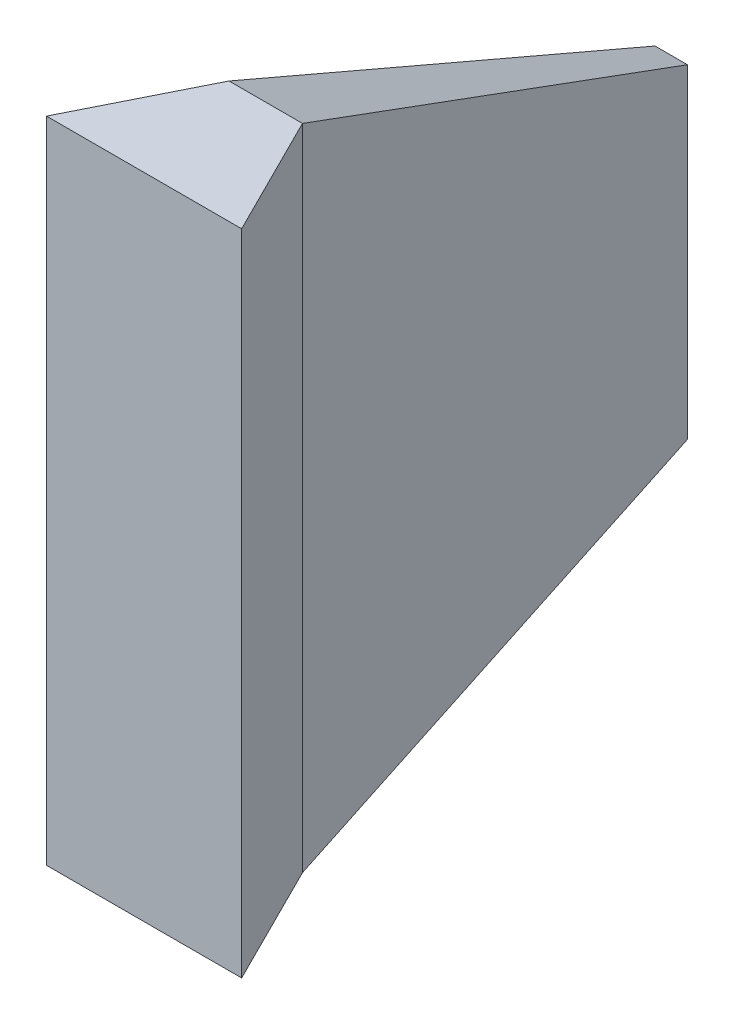
ISO-10303-21;
HEADER;
FILE_DESCRIPTION(('STEP AP214'),'2;1');
FILE_NAME('part.step','',(''),(''),'','','');
FILE_SCHEMA(('AUTOMOTIVE_DESIGN { 1 0 10303 214 1 1 1 1 }'));
ENDSEC;
DATA;
#1=APPLICATION_CONTEXT('core data for automotive mechanical design processes');
#2=APPLICATION_PROTOCOL_DEFINITION('international standard','automotive_design',2000,#1);
#3=PRODUCT_CONTEXT('',#1,'mechanical');
#4=PRODUCT('Part','Part','',(#3));
#5=PRODUCT_RELATED_PRODUCT_CATEGORY('part','',(#4));
#6=PRODUCT_DEFINITION_FORMATION('','',#4);
#7=PRODUCT_DEFINITION_CONTEXT('part definition',#1,'design');
#8=PRODUCT_DEFINITION('design','',#6,#7);
#9=PRODUCT_DEFINITION_SHAPE('','',#8);
#10=(LENGTH_UNIT() NAMED_UNIT(*) SI_UNIT(.MILLI.,.METRE.));
#11=(NAMED_UNIT(*) PLANE_ANGLE_UNIT() SI_UNIT($,.RADIAN.));
#12=(NAMED_UNIT(*) SI_UNIT($,.STERADIAN.) SOLID_ANGLE_UNIT());
#13=UNCERTAINTY_MEASURE_WITH_UNIT(LENGTH_MEASURE(1.E-05),#10,'distance_accuracy_value','');
#14=(GEOMETRIC_REPRESENTATION_CONTEXT(3) GLOBAL_UNCERTAINTY_ASSIGNED_CONTEXT((#13)) GLOBAL_UNIT_ASSIGNED_CONTEXT((#10,
#11,#12)) REPRESENTATION_CONTEXT('',''));
#15=CARTESIAN_POINT('',(0.,0.,0.));
#16=DIRECTION('',(0.,0.,1.));
#17=DIRECTION('',(1.,0.,0.));
#18=AXIS2_PLACEMENT_3D('',#15,#16,#17);
#19=CARTESIAN_POINT('',(0.,80.,0.));
#20=DIRECTION('',(0.,0.,-1.));
#21=DIRECTION('',(-1.,0.,0.));
#22=AXIS2_PLACEMENT_3D('',#19,#20,#21);
#23=PLANE('',#22);
#24=DIRECTION('',(1.,0.,0.));
#25=VECTOR('',#24,1.);
#26=CARTESIAN_POINT('',(0.,0.,0.));
#27=LINE('',#26,#25);
#28=CARTESIAN_POINT('',(-24.06,0.,0.));
#29=VERTEX_POINT('',#28);
#30=CARTESIAN_POINT('',(0.,0.,0.));
#31=VERTEX_POINT('',#30);
#32=EDGE_CURVE('E107',#29,#31,#27,.T.);
#33=ORIENTED_EDGE('',*,*,#32,.T.);
#34=DIRECTION('',(0.,-1.,0.));
#35=VECTOR('',#34,1.);
#36=CARTESIAN_POINT('',(0.,80.,0.));
#37=LINE('',#36,#35);
#38=CARTESIAN_POINT('',(0.,80.,0.));
#39=VERTEX_POINT('',#38);
#40=EDGE_CURVE('E130',#39,#31,#37,.T.);
#41=ORIENTED_EDGE('',*,*,#40,.F.);
#42=DIRECTION('',(1.,0.,0.));
#43=VECTOR('',#42,1.);
#44=CARTESIAN_POINT('',(0.,80.,0.));
#45=LINE('',#44,#43);
#46=CARTESIAN_POINT('',(-24.06,80.,0.));
#47=VERTEX_POINT('',#46);
#48=EDGE_CURVE('E101',#47,#39,#45,.T.);
#49=ORIENTED_EDGE('',*,*,#48,.F.);
#50=DIRECTION('',(0.,-1.,0.));
#51=VECTOR('',#50,1.);
#52=CARTESIAN_POINT('',(-24.06,80.,0.));
#53=LINE('',#52,#51);
#54=EDGE_CURVE('E92',#47,#29,#53,.T.);
#55=ORIENTED_EDGE('',*,*,#54,.T.);
#56=EDGE_LOOP('',(#33,#41,#49,#55));
#57=FACE_BOUND('',#56,.T.);
#58=ADVANCED_FACE('F51',(#57),#23,.F.);
#59=CARTESIAN_POINT('',(-7.5,80.,-14.9994299891696));
#60=DIRECTION('',(-0.894420392914108,0.,0.447227191413238));
#61=DIRECTION('',(0.447227191413238,0.,0.894420392914108));
#62=AXIS2_PLACEMENT_3D('',#59,#60,#61);
#63=PLANE('',#62);
#64=DIRECTION('',(-0.447227191413238,0.,-0.894420392914108));
#65=VECTOR('',#64,1.);
#66=CARTESIAN_POINT('',(-7.5,0.,-14.9994299891696));
#67=LINE('',#66,#65);
#68=CARTESIAN_POINT('',(-7.5,0.,-14.9994299891696));
#69=VERTEX_POINT('',#68);
#70=EDGE_CURVE('E102',#31,#69,#67,.T.);
#71=ORIENTED_EDGE('',*,*,#70,.T.);
#72=DIRECTION('',(0.,-1.,0.));
#73=VECTOR('',#72,1.);
#74=CARTESIAN_POINT('',(-7.5,80.,-14.9994299891696));
#75=LINE('',#74,#73);
#76=CARTESIAN_POINT('',(-7.5,80.,-14.9994299891696));
#77=VERTEX_POINT('',#76);
#78=EDGE_CURVE('E126',#77,#69,#75,.T.);
#79=ORIENTED_EDGE('',*,*,#78,.F.);
#80=DIRECTION('',(-0.447227191413238,0.,-0.894420392914108));
#81=VECTOR('',#80,1.);
#82=CARTESIAN_POINT('',(-7.5,80.,-14.9994299891696));
#83=LINE('',#82,#81);
#84=EDGE_CURVE('E177',#39,#77,#83,.T.);
#85=ORIENTED_EDGE('',*,*,#84,.F.);
#86=ORIENTED_EDGE('',*,*,#40,.T.);
#87=EDGE_LOOP('',(#71,#79,#85,#86));
#88=FACE_BOUND('',#87,.T.);
#89=ADVANCED_FACE('F185',(#88),#63,.F.);
#90=CARTESIAN_POINT('',(-24.06,80.,0.));
#91=DIRECTION('',(0.894420392914108,0.,0.447227191413238));
#92=DIRECTION('',(0.447227191413238,0.,-0.894420392914108));
#93=AXIS2_PLACEMENT_3D('',#90,#91,#92);
#94=PLANE('',#93);
#95=DIRECTION('',(-0.447227191413238,0.,0.894420392914108));
#96=VECTOR('',#95,1.);
#97=CARTESIAN_POINT('',(-24.06,0.,0.));
#98=LINE('',#97,#96);
#99=CARTESIAN_POINT('',(-16.56,0.,-14.9994299891696));
#100=VERTEX_POINT('',#99);
#101=EDGE_CURVE('E89',#100,#29,#98,.T.);
#102=ORIENTED_EDGE('',*,*,#101,.T.);
#103=ORIENTED_EDGE('',*,*,#54,.F.);
#104=DIRECTION('',(-0.447227191413238,0.,0.894420392914108));
#105=VECTOR('',#104,1.);
#106=CARTESIAN_POINT('',(-24.06,80.,0.));
#107=LINE('',#106,#105);
#108=CARTESIAN_POINT('',(-16.56,80.,-14.9994299891696));
#109=VERTEX_POINT('',#108);
#110=EDGE_CURVE('E75',#109,#47,#107,.T.);
#111=ORIENTED_EDGE('',*,*,#110,.F.);
#112=DIRECTION('',(0.,-1.,0.));
#113=VECTOR('',#112,1.);
#114=CARTESIAN_POINT('',(-16.56,80.,-14.9994299891696));
#115=LINE('',#114,#113);
#116=EDGE_CURVE('E96',#109,#100,#115,.T.);
#117=ORIENTED_EDGE('',*,*,#116,.T.);
#118=EDGE_LOOP('',(#102,#103,#111,#117));
#119=FACE_BOUND('',#118,.T.);
#120=ADVANCED_FACE('F91',(#119),#94,.F.);
#121=CARTESIAN_POINT('',(0.,80.,0.));
#122=DIRECTION('',(0.,-1.,0.));
#123=DIRECTION('',(0.,0.,-1.));
#124=AXIS2_PLACEMENT_3D('',#121,#122,#123);
#125=PLANE('',#124);
#126=ORIENTED_EDGE('',*,*,#84,.T.);
#127=DIRECTION('',(-1.,0.,0.));
#128=VECTOR('',#127,1.);
#129=CARTESIAN_POINT('',(0.,80.,-14.9994299891696));
#130=LINE('',#129,#128);
#131=EDGE_CURVE('E114',#77,#109,#130,.T.);
#132=ORIENTED_EDGE('',*,*,#131,.T.);
#133=ORIENTED_EDGE('',*,*,#110,.T.);
#134=ORIENTED_EDGE('',*,*,#48,.T.);
#135=EDGE_LOOP('',(#126,#132,#133,#134));
#136=FACE_BOUND('',#135,.T.);
#137=ADVANCED_FACE('F181',(#136),#125,.F.);
#138=CARTESIAN_POINT('',(0.,0.,0.));
#139=DIRECTION('',(0.,-1.,0.));
#140=DIRECTION('',(0.,0.,-1.));
#141=AXIS2_PLACEMENT_3D('',#138,#139,#140);
#142=PLANE('',#141);
#143=DIRECTION('',(-1.,0.,0.));
#144=VECTOR('',#143,1.);
#145=CARTESIAN_POINT('',(0.,0.,-14.9994299891696));
#146=LINE('',#145,#144);
#147=EDGE_CURVE('E119',#69,#100,#146,.T.);
#148=ORIENTED_EDGE('',*,*,#147,.F.);
#149=ORIENTED_EDGE('',*,*,#70,.F.);
#150=ORIENTED_EDGE('',*,*,#32,.F.);
#151=ORIENTED_EDGE('',*,*,#101,.F.);
#152=EDGE_LOOP('',(#148,#149,#150,#151));
#153=FACE_BOUND('',#152,.T.);
#154=ADVANCED_FACE('F110',(#153),#142,.T.);
#155=CARTESIAN_POINT('',(0.,0.,-64.9994299891696));
#156=DIRECTION('',(0.,0.,-1.));
#157=DIRECTION('',(-1.,0.,0.));
#158=AXIS2_PLACEMENT_3D('',#155,#156,#157);
#159=PLANE('',#158);
#160=DIRECTION('',(0.,1.,0.));
#161=VECTOR('',#160,1.);
#162=CARTESIAN_POINT('',(-14.03,0.,-64.9994299891696));
#163=LINE('',#162,#161);
#164=CARTESIAN_POINT('',(-14.03,20.,-64.9994299891696));
#165=VERTEX_POINT('',#164);
#166=CARTESIAN_POINT('',(-14.03,60.,-64.9994299891696));
#167=VERTEX_POINT('',#166);
#168=EDGE_CURVE('E154',#165,#167,#163,.T.);
#169=ORIENTED_EDGE('',*,*,#168,.T.);
#170=DIRECTION('',(-1.,0.,0.));
#171=VECTOR('',#170,1.);
#172=CARTESIAN_POINT('',(0.,60.,-64.9994299891696));
#173=LINE('',#172,#171);
#174=CARTESIAN_POINT('',(-10.03,60.,-64.9994299891696));
#175=VERTEX_POINT('',#174);
#176=EDGE_CURVE('E137',#175,#167,#173,.T.);
#177=ORIENTED_EDGE('',*,*,#176,.F.);
#178=DIRECTION('',(0.,1.,0.));
#179=VECTOR('',#178,1.);
#180=CARTESIAN_POINT('',(-10.03,0.,-64.9994299891696));
#181=LINE('',#180,#179);
#182=CARTESIAN_POINT('',(-10.03,20.,-64.9994299891696));
#183=VERTEX_POINT('',#182);
#184=EDGE_CURVE('E66',#183,#175,#181,.T.);
#185=ORIENTED_EDGE('',*,*,#184,.F.);
#186=DIRECTION('',(1.,0.,0.));
#187=VECTOR('',#186,1.);
#188=CARTESIAN_POINT('',(0.,20.,-64.9994299891696));
#189=LINE('',#188,#187);
#190=EDGE_CURVE('E133',#165,#183,#189,.T.);
#191=ORIENTED_EDGE('',*,*,#190,.F.);
#192=EDGE_LOOP('',(#169,#177,#185,#191));
#193=FACE_BOUND('',#192,.T.);
#194=ADVANCED_FACE('F150',(#193),#159,.T.);
#195=CARTESIAN_POINT('',(0.,20.,-64.9994299891696));
#196=DIRECTION('',(0.,0.928476690885259,0.371390676354104));
#197=DIRECTION('',(0.,-0.371390676354104,0.928476690885259));
#198=AXIS2_PLACEMENT_3D('',#195,#196,#197);
#199=PLANE('',#198);
#200=ORIENTED_EDGE('',*,*,#147,.T.);
#201=DIRECTION('',(0.04692915792525,0.370981485575099,-0.927453713937747));
#202=VECTOR('',#201,1.);
#203=CARTESIAN_POINT('',(-13.9991010875341,20.2442601775963,-65.6100804331603));
#204=LINE('',#203,#202);
#205=EDGE_CURVE('E167',#100,#165,#204,.T.);
#206=ORIENTED_EDGE('',*,*,#205,.T.);
#207=ORIENTED_EDGE('',*,*,#190,.T.);
#208=DIRECTION('',(0.04692915792525,-0.370981485575099,0.927453713937747));
#209=VECTOR('',#208,1.);
#210=CARTESIAN_POINT('',(-10.0079104709884,19.8253792172993,-64.5628780324179));
#211=LINE('',#210,#209);
#212=EDGE_CURVE('E162',#183,#69,#211,.T.);
#213=ORIENTED_EDGE('',*,*,#212,.T.);
#214=EDGE_LOOP('',(#200,#206,#207,#213));
#215=FACE_BOUND('',#214,.T.);
#216=ADVANCED_FACE('F189',(#215),#199,.F.);
#217=CARTESIAN_POINT('',(0.,80.,-14.9994299891696));
#218=DIRECTION('',(0.,-0.928476690885259,0.371390676354104));
#219=DIRECTION('',(0.,-0.371390676354104,-0.928476690885259));
#220=AXIS2_PLACEMENT_3D('',#217,#218,#219);
#221=PLANE('',#220);
#222=ORIENTED_EDGE('',*,*,#176,.T.);
#223=DIRECTION('',(-0.04692915792525,0.370981485575099,0.927453713937747));
#224=VECTOR('',#223,1.);
#225=CARTESIAN_POINT('',(-16.5235291524992,79.7116929051323,-15.720197726339));
#226=LINE('',#225,#224);
#227=EDGE_CURVE('E11',#167,#109,#226,.T.);
#228=ORIENTED_EDGE('',*,*,#227,.T.);
#229=ORIENTED_EDGE('',*,*,#131,.F.);
#230=DIRECTION('',(-0.04692915792525,-0.370981485575099,-0.927453713937747));
#231=VECTOR('',#230,1.);
#232=CARTESIAN_POINT('',(-7.4834824060232,80.1305738654292,-14.6729953255965));
#233=LINE('',#232,#231);
#234=EDGE_CURVE('E59',#77,#175,#233,.T.);
#235=ORIENTED_EDGE('',*,*,#234,.T.);
#236=EDGE_LOOP('',(#222,#228,#229,#235));
#237=FACE_BOUND('',#236,.T.);
#238=ADVANCED_FACE('F144',(#237),#221,.F.);
#239=CARTESIAN_POINT('',(-10.03,0.,-64.9994299891696));
#240=DIRECTION('',(-0.99872227305788,0.,0.0505353470167287));
#241=DIRECTION('',(0.0505353470167287,0.,0.99872227305788));
#242=AXIS2_PLACEMENT_3D('',#239,#240,#241);
#243=PLANE('',#242);
#244=ORIENTED_EDGE('',*,*,#184,.T.);
#245=ORIENTED_EDGE('',*,*,#234,.F.);
#246=ORIENTED_EDGE('',*,*,#78,.T.);
#247=ORIENTED_EDGE('',*,*,#212,.F.);
#248=EDGE_LOOP('',(#244,#245,#246,#247));
#249=FACE_BOUND('',#248,.T.);
#250=ADVANCED_FACE('F186',(#249),#243,.F.);
#251=CARTESIAN_POINT('',(-16.56,0.,-14.9994299891696));
#252=DIRECTION('',(0.99872227305788,0.,0.0505353470167288));
#253=DIRECTION('',(0.0505353470167288,0.,-0.99872227305788));
#254=AXIS2_PLACEMENT_3D('',#251,#252,#253);
#255=PLANE('',#254);
#256=ORIENTED_EDGE('',*,*,#116,.F.);
#257=ORIENTED_EDGE('',*,*,#227,.F.);
#258=ORIENTED_EDGE('',*,*,#168,.F.);
#259=ORIENTED_EDGE('',*,*,#205,.F.);
#260=EDGE_LOOP('',(#256,#257,#258,#259));
#261=FACE_BOUND('',#260,.T.);
#262=ADVANCED_FACE('F193',(#261),#255,.F.);
#263=CLOSED_SHELL('',(#58,#89,#120,#137,#154,#194,#216,#238,#250,#262));
#264=MANIFOLD_SOLID_BREP('B2',#263);
#265=ADVANCED_BREP_SHAPE_REPRESENTATION('',(#18,#264),#14);
#266=SHAPE_DEFINITION_REPRESENTATION(#9,#265);
ENDSEC;
END-ISO-10303-21;
